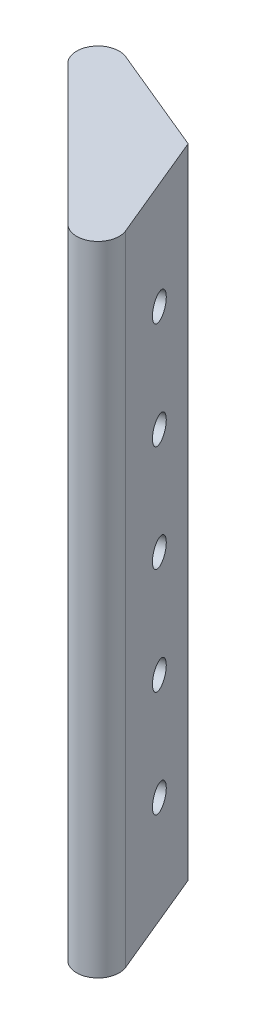
ISO-10303-21;
HEADER;
FILE_DESCRIPTION(('STEP AP214'),'2;1');
FILE_NAME('part.step','',(''),(''),'','','');
FILE_SCHEMA(('AUTOMOTIVE_DESIGN { 1 0 10303 214 1 1 1 1 }'));
ENDSEC;
DATA;
#1=APPLICATION_CONTEXT('core data for automotive mechanical design processes');
#2=APPLICATION_PROTOCOL_DEFINITION('international standard','automotive_design',2000,#1);
#3=PRODUCT_CONTEXT('',#1,'mechanical');
#4=PRODUCT('Part','Part','',(#3));
#5=PRODUCT_RELATED_PRODUCT_CATEGORY('part','',(#4));
#6=PRODUCT_DEFINITION_FORMATION('','',#4);
#7=PRODUCT_DEFINITION_CONTEXT('part definition',#1,'design');
#8=PRODUCT_DEFINITION('design','',#6,#7);
#9=PRODUCT_DEFINITION_SHAPE('','',#8);
#10=(LENGTH_UNIT() NAMED_UNIT(*) SI_UNIT(.MILLI.,.METRE.));
#11=(NAMED_UNIT(*) PLANE_ANGLE_UNIT() SI_UNIT($,.RADIAN.));
#12=(NAMED_UNIT(*) SI_UNIT($,.STERADIAN.) SOLID_ANGLE_UNIT());
#13=UNCERTAINTY_MEASURE_WITH_UNIT(LENGTH_MEASURE(1.E-05),#10,'distance_accuracy_value','');
#14=(GEOMETRIC_REPRESENTATION_CONTEXT(3) GLOBAL_UNCERTAINTY_ASSIGNED_CONTEXT((#13)) GLOBAL_UNIT_ASSIGNED_CONTEXT((#10,
#11,#12)) REPRESENTATION_CONTEXT('',''));
#15=CARTESIAN_POINT('',(0.,0.,0.));
#16=DIRECTION('',(0.,0.,1.));
#17=DIRECTION('',(1.,0.,0.));
#18=AXIS2_PLACEMENT_3D('',#15,#16,#17);
#19=CARTESIAN_POINT('',(252.896471972286,90.,-238.719834657845));
#20=DIRECTION('',(-0.923879532511289,0.,0.382683432365085));
#21=DIRECTION('',(0.382683432365085,0.,0.923879532511289));
#22=AXIS2_PLACEMENT_3D('',#19,#20,#21);
#23=PLANE('',#22);
#24=CARTESIAN_POINT('',(250.657648199135,80.,-244.124833374748));
#25=DIRECTION('',(0.923879532511287,0.,-0.38268343236509));
#26=DIRECTION('',(-0.38268343236509,0.,-0.923879532511287));
#27=AXIS2_PLACEMENT_3D('',#24,#25,#26);
#28=CIRCLE('',#27,1.20000000000003);
#29=CARTESIAN_POINT('',(250.198428080297,80.,-245.233488813762));
#30=VERTEX_POINT('',#29);
#31=EDGE_CURVE('E148',#30,#30,#28,.T.);
#32=ORIENTED_EDGE('',*,*,#31,.F.);
#33=EDGE_LOOP('',(#32));
#34=FACE_BOUND('',#33,.T.);
#35=CARTESIAN_POINT('',(250.657648199134,70.,-244.12483337475));
#36=DIRECTION('',(0.923879532511287,0.,-0.38268343236509));
#37=DIRECTION('',(-0.38268343236509,0.,-0.923879532511287));
#38=AXIS2_PLACEMENT_3D('',#35,#36,#37);
#39=CIRCLE('',#38,1.20000000000001);
#40=CARTESIAN_POINT('',(250.198428080296,70.,-245.233488813764));
#41=VERTEX_POINT('',#40);
#42=EDGE_CURVE('E152',#41,#41,#39,.T.);
#43=ORIENTED_EDGE('',*,*,#42,.F.);
#44=EDGE_LOOP('',(#43));
#45=FACE_BOUND('',#44,.T.);
#46=CARTESIAN_POINT('',(250.657648199135,60.,-244.124833374748));
#47=DIRECTION('',(0.923879532511287,0.,-0.38268343236509));
#48=DIRECTION('',(-0.38268343236509,0.,-0.923879532511287));
#49=AXIS2_PLACEMENT_3D('',#46,#47,#48);
#50=CIRCLE('',#49,1.20000000000003);
#51=CARTESIAN_POINT('',(250.198428080297,60.,-245.233488813762));
#52=VERTEX_POINT('',#51);
#53=EDGE_CURVE('E156',#52,#52,#50,.T.);
#54=ORIENTED_EDGE('',*,*,#53,.F.);
#55=EDGE_LOOP('',(#54));
#56=FACE_BOUND('',#55,.T.);
#57=CARTESIAN_POINT('',(250.657648199134,50.,-244.12483337475));
#58=DIRECTION('',(0.923879532511287,0.,-0.38268343236509));
#59=DIRECTION('',(-0.38268343236509,0.,-0.923879532511287));
#60=AXIS2_PLACEMENT_3D('',#57,#58,#59);
#61=CIRCLE('',#60,1.20000000000001);
#62=CARTESIAN_POINT('',(250.198428080296,50.,-245.233488813764));
#63=VERTEX_POINT('',#62);
#64=EDGE_CURVE('E160',#63,#63,#61,.T.);
#65=ORIENTED_EDGE('',*,*,#64,.F.);
#66=EDGE_LOOP('',(#65));
#67=FACE_BOUND('',#66,.T.);
#68=CARTESIAN_POINT('',(250.657648199135,40.,-244.124833374748));
#69=DIRECTION('',(0.923879532511287,0.,-0.38268343236509));
#70=DIRECTION('',(-0.38268343236509,0.,-0.923879532511287));
#71=AXIS2_PLACEMENT_3D('',#68,#69,#70);
#72=CIRCLE('',#71,1.20000000000003);
#73=CARTESIAN_POINT('',(250.198428080297,40.,-245.233488813762));
#74=VERTEX_POINT('',#73);
#75=EDGE_CURVE('E163',#74,#74,#72,.T.);
#76=ORIENTED_EDGE('',*,*,#75,.F.);
#77=EDGE_LOOP('',(#76));
#78=FACE_BOUND('',#77,.T.);
#79=DIRECTION('',(-0.382683432365085,0.,-0.923879532511289));
#80=VECTOR('',#79,1.);
#81=CARTESIAN_POINT('',(252.896471972286,30.,-238.719834657845));
#82=LINE('',#81,#80);
#83=CARTESIAN_POINT('',(252.896471972286,30.,-238.719834657845));
#84=VERTEX_POINT('',#83);
#85=CARTESIAN_POINT('',(248.744231037308,30.,-248.744231037309));
#86=VERTEX_POINT('',#85);
#87=EDGE_CURVE('E110',#84,#86,#82,.T.);
#88=ORIENTED_EDGE('',*,*,#87,.T.);
#89=DIRECTION('',(0.,-1.,0.));
#90=VECTOR('',#89,1.);
#91=CARTESIAN_POINT('',(248.744231037308,90.,-248.744231037309));
#92=LINE('',#91,#90);
#93=CARTESIAN_POINT('',(248.744231037308,90.,-248.744231037309));
#94=VERTEX_POINT('',#93);
#95=EDGE_CURVE('E11',#94,#86,#92,.T.);
#96=ORIENTED_EDGE('',*,*,#95,.F.);
#97=DIRECTION('',(-0.382683432365085,0.,-0.923879532511289));
#98=VECTOR('',#97,1.);
#99=CARTESIAN_POINT('',(252.896471972286,90.,-238.719834657845));
#100=LINE('',#99,#98);
#101=CARTESIAN_POINT('',(252.896471972286,90.,-238.719834657845));
#102=VERTEX_POINT('',#101);
#103=EDGE_CURVE('E119',#102,#94,#100,.T.);
#104=ORIENTED_EDGE('',*,*,#103,.F.);
#105=DIRECTION('',(0.,-1.,0.));
#106=VECTOR('',#105,1.);
#107=CARTESIAN_POINT('',(252.896471972286,90.,-238.719834657845));
#108=LINE('',#107,#106);
#109=EDGE_CURVE('E106',#102,#84,#108,.T.);
#110=ORIENTED_EDGE('',*,*,#109,.T.);
#111=EDGE_LOOP('',(#88,#96,#104,#110));
#112=FACE_BOUND('',#111,.T.);
#113=ADVANCED_FACE('F36',(#34,#45,#56,#67,#78,#112),#23,.F.);
#114=CARTESIAN_POINT('',(248.744231037308,90.,-248.744231037309));
#115=DIRECTION('',(-0.382683432365088,0.,0.923879532511288));
#116=DIRECTION('',(0.923879532511288,0.,0.382683432365088));
#117=AXIS2_PLACEMENT_3D('',#114,#115,#116);
#118=PLANE('',#117);
#119=CARTESIAN_POINT('',(244.124833374753,80.,-250.657648199133));
#120=DIRECTION('',(0.38268343236509,0.,-0.923879532511287));
#121=DIRECTION('',(-0.923879532511287,0.,-0.38268343236509));
#122=AXIS2_PLACEMENT_3D('',#119,#120,#121);
#123=CIRCLE('',#122,1.20000000000003);
#124=CARTESIAN_POINT('',(243.016177935739,80.,-251.116868317972));
#125=VERTEX_POINT('',#124);
#126=EDGE_CURVE('E173',#125,#125,#123,.T.);
#127=ORIENTED_EDGE('',*,*,#126,.F.);
#128=EDGE_LOOP('',(#127));
#129=FACE_BOUND('',#128,.T.);
#130=CARTESIAN_POINT('',(244.124833374755,70.,-250.657648199133));
#131=DIRECTION('',(0.38268343236509,0.,-0.923879532511287));
#132=DIRECTION('',(-0.923879532511287,0.,-0.38268343236509));
#133=AXIS2_PLACEMENT_3D('',#130,#131,#132);
#134=CIRCLE('',#133,1.20000000000003);
#135=CARTESIAN_POINT('',(243.016177935742,70.,-251.116868317971));
#136=VERTEX_POINT('',#135);
#137=EDGE_CURVE('E179',#136,#136,#134,.T.);
#138=ORIENTED_EDGE('',*,*,#137,.F.);
#139=EDGE_LOOP('',(#138));
#140=FACE_BOUND('',#139,.T.);
#141=CARTESIAN_POINT('',(244.124833374753,60.,-250.657648199133));
#142=DIRECTION('',(0.38268343236509,0.,-0.923879532511287));
#143=DIRECTION('',(-0.923879532511287,0.,-0.38268343236509));
#144=AXIS2_PLACEMENT_3D('',#141,#142,#143);
#145=CIRCLE('',#144,1.20000000000003);
#146=CARTESIAN_POINT('',(243.016177935739,60.,-251.116868317972));
#147=VERTEX_POINT('',#146);
#148=EDGE_CURVE('E185',#147,#147,#145,.T.);
#149=ORIENTED_EDGE('',*,*,#148,.F.);
#150=EDGE_LOOP('',(#149));
#151=FACE_BOUND('',#150,.T.);
#152=CARTESIAN_POINT('',(244.124833374755,50.,-250.657648199133));
#153=DIRECTION('',(0.38268343236509,0.,-0.923879532511287));
#154=DIRECTION('',(-0.923879532511287,0.,-0.38268343236509));
#155=AXIS2_PLACEMENT_3D('',#152,#153,#154);
#156=CIRCLE('',#155,1.20000000000003);
#157=CARTESIAN_POINT('',(243.016177935742,50.,-251.116868317971));
#158=VERTEX_POINT('',#157);
#159=EDGE_CURVE('E191',#158,#158,#156,.T.);
#160=ORIENTED_EDGE('',*,*,#159,.F.);
#161=EDGE_LOOP('',(#160));
#162=FACE_BOUND('',#161,.T.);
#163=CARTESIAN_POINT('',(244.124833374753,40.,-250.657648199133));
#164=DIRECTION('',(0.38268343236509,0.,-0.923879532511287));
#165=DIRECTION('',(-0.923879532511287,0.,-0.38268343236509));
#166=AXIS2_PLACEMENT_3D('',#163,#164,#165);
#167=CIRCLE('',#166,1.20000000000003);
#168=CARTESIAN_POINT('',(243.016177935739,40.,-251.116868317972));
#169=VERTEX_POINT('',#168);
#170=EDGE_CURVE('E197',#169,#169,#167,.T.);
#171=ORIENTED_EDGE('',*,*,#170,.F.);
#172=EDGE_LOOP('',(#171));
#173=FACE_BOUND('',#172,.T.);
#174=DIRECTION('',(-0.923879532511288,0.,-0.382683432365087));
#175=VECTOR('',#174,1.);
#176=CARTESIAN_POINT('',(248.744231037308,30.,-248.744231037309));
#177=LINE('',#176,#175);
#178=CARTESIAN_POINT('',(238.719834657845,30.,-252.896471972286));
#179=VERTEX_POINT('',#178);
#180=EDGE_CURVE('E113',#86,#179,#177,.T.);
#181=ORIENTED_EDGE('',*,*,#180,.T.);
#182=DIRECTION('',(0.,-1.,0.));
#183=VECTOR('',#182,1.);
#184=CARTESIAN_POINT('',(238.719834657845,90.,-252.896471972286));
#185=LINE('',#184,#183);
#186=CARTESIAN_POINT('',(238.719834657845,90.,-252.896471972286));
#187=VERTEX_POINT('',#186);
#188=EDGE_CURVE('E44',#187,#179,#185,.T.);
#189=ORIENTED_EDGE('',*,*,#188,.F.);
#190=DIRECTION('',(-0.923879532511288,0.,-0.382683432365087));
#191=VECTOR('',#190,1.);
#192=CARTESIAN_POINT('',(248.744231037308,90.,-248.744231037309));
#193=LINE('',#192,#191);
#194=EDGE_CURVE('E86',#94,#187,#193,.T.);
#195=ORIENTED_EDGE('',*,*,#194,.F.);
#196=ORIENTED_EDGE('',*,*,#95,.T.);
#197=EDGE_LOOP('',(#181,#189,#195,#196));
#198=FACE_BOUND('',#197,.T.);
#199=ADVANCED_FACE('F139',(#129,#140,#151,#162,#173,#198),#118,.F.);
#200=CARTESIAN_POINT('',(237.954467793115,90.,-251.048712907264));
#201=DIRECTION('',(0.,-1.,0.));
#202=DIRECTION('',(0.,0.,-1.));
#203=AXIS2_PLACEMENT_3D('',#200,#201,#202);
#204=CYLINDRICAL_SURFACE('',#203,1.99999999999994);
#205=CARTESIAN_POINT('',(237.954467793115,30.,-251.048712907264));
#206=DIRECTION('',(0.,1.,0.));
#207=DIRECTION('',(0.,0.,1.));
#208=AXIS2_PLACEMENT_3D('',#205,#206,#207);
#209=CIRCLE('',#208,1.99999999999994);
#210=CARTESIAN_POINT('',(236.540254230742,30.,-249.634499344891));
#211=VERTEX_POINT('',#210);
#212=EDGE_CURVE('E101',#179,#211,#209,.T.);
#213=ORIENTED_EDGE('',*,*,#212,.T.);
#214=DIRECTION('',(0.,-1.,0.));
#215=VECTOR('',#214,1.);
#216=CARTESIAN_POINT('',(236.540254230742,90.,-249.634499344891));
#217=LINE('',#216,#215);
#218=CARTESIAN_POINT('',(236.540254230742,90.,-249.634499344891));
#219=VERTEX_POINT('',#218);
#220=EDGE_CURVE('E98',#219,#211,#217,.T.);
#221=ORIENTED_EDGE('',*,*,#220,.F.);
#222=CARTESIAN_POINT('',(237.954467793115,90.,-251.048712907264));
#223=DIRECTION('',(0.,1.,0.));
#224=DIRECTION('',(0.,0.,1.));
#225=AXIS2_PLACEMENT_3D('',#222,#223,#224);
#226=CIRCLE('',#225,1.99999999999994);
#227=EDGE_CURVE('E90',#187,#219,#226,.T.);
#228=ORIENTED_EDGE('',*,*,#227,.F.);
#229=ORIENTED_EDGE('',*,*,#188,.T.);
#230=EDGE_LOOP('',(#213,#221,#228,#229));
#231=FACE_BOUND('',#230,.T.);
#232=ADVANCED_FACE('F99',(#231),#204,.T.);
#233=CARTESIAN_POINT('',(236.540254230742,90.,-249.634499344891));
#234=DIRECTION('',(0.707106781186548,0.,-0.707106781186547));
#235=DIRECTION('',(-0.707106781186547,0.,-0.707106781186548));
#236=AXIS2_PLACEMENT_3D('',#233,#234,#235);
#237=PLANE('',#236);
#238=CARTESIAN_POINT('',(244.571065360963,80.,-241.60368821467));
#239=DIRECTION('',(0.707106781186548,0.,-0.707106781186547));
#240=DIRECTION('',(0.707106781186547,0.,0.707106781186548));
#241=AXIS2_PLACEMENT_3D('',#238,#239,#240);
#242=ELLIPSE('',#241,1.29887064035091,1.20000000000003);
#243=CARTESIAN_POINT('',(245.489505598639,80.,-240.685247976993));
#244=VERTEX_POINT('',#243);
#245=EDGE_CURVE('E200',#244,#244,#242,.F.);
#246=ORIENTED_EDGE('',*,*,#245,.F.);
#247=EDGE_LOOP('',(#246));
#248=FACE_BOUND('',#247,.T.);
#249=CARTESIAN_POINT('',(244.571065360961,70.,-241.603688214672));
#250=DIRECTION('',(0.707106781186548,0.,-0.707106781186547));
#251=DIRECTION('',(0.707106781186547,0.,0.707106781186548));
#252=AXIS2_PLACEMENT_3D('',#249,#250,#251);
#253=ELLIPSE('',#252,1.29887064035088,1.20000000000001);
#254=CARTESIAN_POINT('',(245.489505598637,70.,-240.685247976995));
#255=VERTEX_POINT('',#254);
#256=EDGE_CURVE('E256',#255,#255,#253,.F.);
#257=ORIENTED_EDGE('',*,*,#256,.F.);
#258=EDGE_LOOP('',(#257));
#259=FACE_BOUND('',#258,.T.);
#260=CARTESIAN_POINT('',(244.571065360963,60.,-241.60368821467));
#261=DIRECTION('',(0.707106781186548,0.,-0.707106781186547));
#262=DIRECTION('',(0.707106781186547,0.,0.707106781186548));
#263=AXIS2_PLACEMENT_3D('',#260,#261,#262);
#264=ELLIPSE('',#263,1.29887064035091,1.20000000000003);
#265=CARTESIAN_POINT('',(245.489505598639,60.,-240.685247976993));
#266=VERTEX_POINT('',#265);
#267=EDGE_CURVE('E262',#266,#266,#264,.F.);
#268=ORIENTED_EDGE('',*,*,#267,.F.);
#269=EDGE_LOOP('',(#268));
#270=FACE_BOUND('',#269,.T.);
#271=CARTESIAN_POINT('',(244.571065360961,50.,-241.603688214672));
#272=DIRECTION('',(0.707106781186548,0.,-0.707106781186547));
#273=DIRECTION('',(0.707106781186547,0.,0.707106781186548));
#274=AXIS2_PLACEMENT_3D('',#271,#272,#273);
#275=ELLIPSE('',#274,1.29887064035088,1.20000000000001);
#276=CARTESIAN_POINT('',(245.489505598637,50.,-240.685247976995));
#277=VERTEX_POINT('',#276);
#278=EDGE_CURVE('E170',#277,#277,#275,.F.);
#279=ORIENTED_EDGE('',*,*,#278,.F.);
#280=EDGE_LOOP('',(#279));
#281=FACE_BOUND('',#280,.T.);
#282=CARTESIAN_POINT('',(244.571065360963,40.,-241.60368821467));
#283=DIRECTION('',(0.707106781186548,0.,-0.707106781186547));
#284=DIRECTION('',(0.707106781186547,0.,0.707106781186548));
#285=AXIS2_PLACEMENT_3D('',#282,#283,#284);
#286=ELLIPSE('',#285,1.29887064035091,1.20000000000003);
#287=CARTESIAN_POINT('',(245.489505598639,40.,-240.685247976993));
#288=VERTEX_POINT('',#287);
#289=EDGE_CURVE('E165',#288,#288,#286,.F.);
#290=ORIENTED_EDGE('',*,*,#289,.F.);
#291=EDGE_LOOP('',(#290));
#292=FACE_BOUND('',#291,.T.);
#293=CARTESIAN_POINT('',(241.603688214674,80.,-244.571065360959));
#294=DIRECTION('',(0.707106781186548,0.,-0.707106781186547));
#295=DIRECTION('',(-0.707106781186547,0.,-0.707106781186548));
#296=AXIS2_PLACEMENT_3D('',#293,#294,#295);
#297=ELLIPSE('',#296,1.29887064035091,1.20000000000003);
#298=CARTESIAN_POINT('',(240.685247976997,80.,-245.489505598635));
#299=VERTEX_POINT('',#298);
#300=EDGE_CURVE('E114',#299,#299,#297,.F.);
#301=ORIENTED_EDGE('',*,*,#300,.F.);
#302=EDGE_LOOP('',(#301));
#303=FACE_BOUND('',#302,.T.);
#304=CARTESIAN_POINT('',(241.603688214675,70.,-244.571065360957));
#305=DIRECTION('',(0.707106781186548,0.,-0.707106781186547));
#306=DIRECTION('',(-0.707106781186547,0.,-0.707106781186548));
#307=AXIS2_PLACEMENT_3D('',#304,#305,#306);
#308=ELLIPSE('',#307,1.29887064035091,1.20000000000003);
#309=CARTESIAN_POINT('',(240.685247976999,70.,-245.489505598633));
#310=VERTEX_POINT('',#309);
#311=EDGE_CURVE('E176',#310,#310,#308,.F.);
#312=ORIENTED_EDGE('',*,*,#311,.F.);
#313=EDGE_LOOP('',(#312));
#314=FACE_BOUND('',#313,.T.);
#315=CARTESIAN_POINT('',(241.603688214674,60.,-244.571065360959));
#316=DIRECTION('',(0.707106781186548,0.,-0.707106781186547));
#317=DIRECTION('',(-0.707106781186547,0.,-0.707106781186548));
#318=AXIS2_PLACEMENT_3D('',#315,#316,#317);
#319=ELLIPSE('',#318,1.29887064035091,1.20000000000003);
#320=CARTESIAN_POINT('',(240.685247976997,60.,-245.489505598635));
#321=VERTEX_POINT('',#320);
#322=EDGE_CURVE('E182',#321,#321,#319,.F.);
#323=ORIENTED_EDGE('',*,*,#322,.F.);
#324=EDGE_LOOP('',(#323));
#325=FACE_BOUND('',#324,.T.);
#326=CARTESIAN_POINT('',(241.603688214675,50.,-244.571065360957));
#327=DIRECTION('',(0.707106781186548,0.,-0.707106781186547));
#328=DIRECTION('',(-0.707106781186547,0.,-0.707106781186548));
#329=AXIS2_PLACEMENT_3D('',#326,#327,#328);
#330=ELLIPSE('',#329,1.29887064035091,1.20000000000003);
#331=CARTESIAN_POINT('',(240.685247976999,50.,-245.489505598633));
#332=VERTEX_POINT('',#331);
#333=EDGE_CURVE('E188',#332,#332,#330,.F.);
#334=ORIENTED_EDGE('',*,*,#333,.F.);
#335=EDGE_LOOP('',(#334));
#336=FACE_BOUND('',#335,.T.);
#337=CARTESIAN_POINT('',(241.603688214674,40.,-244.571065360959));
#338=DIRECTION('',(0.707106781186548,0.,-0.707106781186547));
#339=DIRECTION('',(-0.707106781186547,0.,-0.707106781186548));
#340=AXIS2_PLACEMENT_3D('',#337,#338,#339);
#341=ELLIPSE('',#340,1.29887064035091,1.20000000000003);
#342=CARTESIAN_POINT('',(240.685247976997,40.,-245.489505598635));
#343=VERTEX_POINT('',#342);
#344=EDGE_CURVE('E194',#343,#343,#341,.F.);
#345=ORIENTED_EDGE('',*,*,#344,.F.);
#346=EDGE_LOOP('',(#345));
#347=FACE_BOUND('',#346,.T.);
#348=DIRECTION('',(0.707106781186547,0.,0.707106781186548));
#349=VECTOR('',#348,1.);
#350=CARTESIAN_POINT('',(236.540254230742,30.,-249.634499344891));
#351=LINE('',#350,#349);
#352=CARTESIAN_POINT('',(249.63449934489,30.,-236.540254230742));
#353=VERTEX_POINT('',#352);
#354=EDGE_CURVE('E72',#211,#353,#351,.T.);
#355=ORIENTED_EDGE('',*,*,#354,.T.);
#356=DIRECTION('',(0.,-1.,0.));
#357=VECTOR('',#356,1.);
#358=CARTESIAN_POINT('',(249.63449934489,90.,-236.540254230742));
#359=LINE('',#358,#357);
#360=CARTESIAN_POINT('',(249.63449934489,90.,-236.540254230742));
#361=VERTEX_POINT('',#360);
#362=EDGE_CURVE('E102',#361,#353,#359,.T.);
#363=ORIENTED_EDGE('',*,*,#362,.F.);
#364=DIRECTION('',(0.707106781186547,0.,0.707106781186548));
#365=VECTOR('',#364,1.);
#366=CARTESIAN_POINT('',(236.540254230742,90.,-249.634499344891));
#367=LINE('',#366,#365);
#368=EDGE_CURVE('E94',#219,#361,#367,.T.);
#369=ORIENTED_EDGE('',*,*,#368,.F.);
#370=ORIENTED_EDGE('',*,*,#220,.T.);
#371=EDGE_LOOP('',(#355,#363,#369,#370));
#372=FACE_BOUND('',#371,.T.);
#373=ADVANCED_FACE('F104',(#248,#259,#270,#281,#292,#303,#314,#325,#336,#347,#372),#237,.F.);
#374=CARTESIAN_POINT('',(251.048712907263,90.,-237.954467793115));
#375=DIRECTION('',(0.,-1.,0.));
#376=DIRECTION('',(0.,0.,-1.));
#377=AXIS2_PLACEMENT_3D('',#374,#375,#376);
#378=CYLINDRICAL_SURFACE('',#377,1.99999999999994);
#379=CARTESIAN_POINT('',(251.048712907263,30.,-237.954467793115));
#380=DIRECTION('',(0.,1.,0.));
#381=DIRECTION('',(0.,0.,1.));
#382=AXIS2_PLACEMENT_3D('',#379,#380,#381);
#383=CIRCLE('',#382,1.99999999999994);
#384=EDGE_CURVE('E78',#353,#84,#383,.T.);
#385=ORIENTED_EDGE('',*,*,#384,.T.);
#386=ORIENTED_EDGE('',*,*,#109,.F.);
#387=CARTESIAN_POINT('',(251.048712907263,90.,-237.954467793115));
#388=DIRECTION('',(0.,1.,0.));
#389=DIRECTION('',(0.,0.,1.));
#390=AXIS2_PLACEMENT_3D('',#387,#388,#389);
#391=CIRCLE('',#390,1.99999999999994);
#392=EDGE_CURVE('E52',#361,#102,#391,.T.);
#393=ORIENTED_EDGE('',*,*,#392,.F.);
#394=ORIENTED_EDGE('',*,*,#362,.T.);
#395=EDGE_LOOP('',(#385,#386,#393,#394));
#396=FACE_BOUND('',#395,.T.);
#397=ADVANCED_FACE('F127',(#396),#378,.T.);
#398=CARTESIAN_POINT('',(237.954467793115,90.,-251.048712907264));
#399=DIRECTION('',(0.,1.,0.));
#400=DIRECTION('',(0.,0.,1.));
#401=AXIS2_PLACEMENT_3D('',#398,#399,#400);
#402=PLANE('',#401);
#403=ORIENTED_EDGE('',*,*,#103,.T.);
#404=ORIENTED_EDGE('',*,*,#194,.T.);
#405=ORIENTED_EDGE('',*,*,#227,.T.);
#406=ORIENTED_EDGE('',*,*,#368,.T.);
#407=ORIENTED_EDGE('',*,*,#392,.T.);
#408=EDGE_LOOP('',(#403,#404,#405,#406,#407));
#409=FACE_BOUND('',#408,.T.);
#410=ADVANCED_FACE('F92',(#409),#402,.T.);
#411=CARTESIAN_POINT('',(237.954467793115,30.,-251.048712907264));
#412=DIRECTION('',(0.,1.,0.));
#413=DIRECTION('',(0.,0.,1.));
#414=AXIS2_PLACEMENT_3D('',#411,#412,#413);
#415=PLANE('',#414);
#416=ORIENTED_EDGE('',*,*,#87,.F.);
#417=ORIENTED_EDGE('',*,*,#384,.F.);
#418=ORIENTED_EDGE('',*,*,#354,.F.);
#419=ORIENTED_EDGE('',*,*,#212,.F.);
#420=ORIENTED_EDGE('',*,*,#180,.F.);
#421=EDGE_LOOP('',(#416,#417,#418,#419,#420));
#422=FACE_BOUND('',#421,.T.);
#423=ADVANCED_FACE('F123',(#422),#415,.F.);
#424=CARTESIAN_POINT('',(240.251309169346,40.,-241.306133528258));
#425=DIRECTION('',(0.38268343236509,0.,-0.923879532511287));
#426=DIRECTION('',(-0.923879532511287,0.,-0.38268343236509));
#427=AXIS2_PLACEMENT_3D('',#424,#425,#426);
#428=CYLINDRICAL_SURFACE('',#427,1.20000000000003);
#429=ORIENTED_EDGE('',*,*,#344,.T.);
#430=EDGE_LOOP('',(#429));
#431=FACE_BOUND('',#430,.T.);
#432=ORIENTED_EDGE('',*,*,#170,.T.);
#433=EDGE_LOOP('',(#432));
#434=FACE_BOUND('',#433,.T.);
#435=ADVANCED_FACE('F205',(#431,#434),#428,.F.);
#436=CARTESIAN_POINT('',(240.251309169348,50.,-241.306133528257));
#437=DIRECTION('',(0.38268343236509,0.,-0.923879532511287));
#438=DIRECTION('',(-0.923879532511287,0.,-0.38268343236509));
#439=AXIS2_PLACEMENT_3D('',#436,#437,#438);
#440=CYLINDRICAL_SURFACE('',#439,1.20000000000003);
#441=ORIENTED_EDGE('',*,*,#333,.T.);
#442=EDGE_LOOP('',(#441));
#443=FACE_BOUND('',#442,.T.);
#444=ORIENTED_EDGE('',*,*,#159,.T.);
#445=EDGE_LOOP('',(#444));
#446=FACE_BOUND('',#445,.T.);
#447=ADVANCED_FACE('F209',(#443,#446),#440,.F.);
#448=CARTESIAN_POINT('',(240.251309169346,60.,-241.306133528258));
#449=DIRECTION('',(0.38268343236509,0.,-0.923879532511287));
#450=DIRECTION('',(-0.923879532511287,0.,-0.38268343236509));
#451=AXIS2_PLACEMENT_3D('',#448,#449,#450);
#452=CYLINDRICAL_SURFACE('',#451,1.20000000000003);
#453=ORIENTED_EDGE('',*,*,#322,.T.);
#454=EDGE_LOOP('',(#453));
#455=FACE_BOUND('',#454,.T.);
#456=ORIENTED_EDGE('',*,*,#148,.T.);
#457=EDGE_LOOP('',(#456));
#458=FACE_BOUND('',#457,.T.);
#459=ADVANCED_FACE('F217',(#455,#458),#452,.F.);
#460=CARTESIAN_POINT('',(240.251309169348,70.,-241.306133528257));
#461=DIRECTION('',(0.38268343236509,0.,-0.923879532511287));
#462=DIRECTION('',(-0.923879532511287,0.,-0.38268343236509));
#463=AXIS2_PLACEMENT_3D('',#460,#461,#462);
#464=CYLINDRICAL_SURFACE('',#463,1.20000000000003);
#465=ORIENTED_EDGE('',*,*,#311,.T.);
#466=EDGE_LOOP('',(#465));
#467=FACE_BOUND('',#466,.T.);
#468=ORIENTED_EDGE('',*,*,#137,.T.);
#469=EDGE_LOOP('',(#468));
#470=FACE_BOUND('',#469,.T.);
#471=ADVANCED_FACE('F223',(#467,#470),#464,.F.);
#472=CARTESIAN_POINT('',(240.251309169346,80.,-241.306133528258));
#473=DIRECTION('',(0.38268343236509,0.,-0.923879532511287));
#474=DIRECTION('',(-0.923879532511287,0.,-0.38268343236509));
#475=AXIS2_PLACEMENT_3D('',#472,#473,#474);
#476=CYLINDRICAL_SURFACE('',#475,1.20000000000003);
#477=ORIENTED_EDGE('',*,*,#300,.T.);
#478=EDGE_LOOP('',(#477));
#479=FACE_BOUND('',#478,.T.);
#480=ORIENTED_EDGE('',*,*,#126,.T.);
#481=EDGE_LOOP('',(#480));
#482=FACE_BOUND('',#481,.T.);
#483=ADVANCED_FACE('F227',(#479,#482),#476,.F.);
#484=CARTESIAN_POINT('',(241.306133528262,40.,-240.251309169342));
#485=DIRECTION('',(0.923879532511287,0.,-0.38268343236509));
#486=DIRECTION('',(-0.38268343236509,0.,-0.923879532511287));
#487=AXIS2_PLACEMENT_3D('',#484,#485,#486);
#488=CYLINDRICAL_SURFACE('',#487,1.20000000000003);
#489=ORIENTED_EDGE('',*,*,#289,.T.);
#490=EDGE_LOOP('',(#489));
#491=FACE_BOUND('',#490,.T.);
#492=ORIENTED_EDGE('',*,*,#75,.T.);
#493=EDGE_LOOP('',(#492));
#494=FACE_BOUND('',#493,.T.);
#495=ADVANCED_FACE('F231',(#491,#494),#488,.F.);
#496=CARTESIAN_POINT('',(241.306133528261,50.,-240.251309169344));
#497=DIRECTION('',(0.923879532511287,0.,-0.38268343236509));
#498=DIRECTION('',(-0.38268343236509,0.,-0.923879532511287));
#499=AXIS2_PLACEMENT_3D('',#496,#497,#498);
#500=CYLINDRICAL_SURFACE('',#499,1.20000000000001);
#501=ORIENTED_EDGE('',*,*,#278,.T.);
#502=EDGE_LOOP('',(#501));
#503=FACE_BOUND('',#502,.T.);
#504=ORIENTED_EDGE('',*,*,#64,.T.);
#505=EDGE_LOOP('',(#504));
#506=FACE_BOUND('',#505,.T.);
#507=ADVANCED_FACE('F235',(#503,#506),#500,.F.);
#508=CARTESIAN_POINT('',(241.306133528262,60.,-240.251309169342));
#509=DIRECTION('',(0.923879532511287,0.,-0.38268343236509));
#510=DIRECTION('',(-0.38268343236509,0.,-0.923879532511287));
#511=AXIS2_PLACEMENT_3D('',#508,#509,#510);
#512=CYLINDRICAL_SURFACE('',#511,1.20000000000003);
#513=ORIENTED_EDGE('',*,*,#267,.T.);
#514=EDGE_LOOP('',(#513));
#515=FACE_BOUND('',#514,.T.);
#516=ORIENTED_EDGE('',*,*,#53,.T.);
#517=EDGE_LOOP('',(#516));
#518=FACE_BOUND('',#517,.T.);
#519=ADVANCED_FACE('F239',(#515,#518),#512,.F.);
#520=CARTESIAN_POINT('',(241.306133528261,70.,-240.251309169344));
#521=DIRECTION('',(0.923879532511287,0.,-0.38268343236509));
#522=DIRECTION('',(-0.38268343236509,0.,-0.923879532511287));
#523=AXIS2_PLACEMENT_3D('',#520,#521,#522);
#524=CYLINDRICAL_SURFACE('',#523,1.20000000000001);
#525=ORIENTED_EDGE('',*,*,#256,.T.);
#526=EDGE_LOOP('',(#525));
#527=FACE_BOUND('',#526,.T.);
#528=ORIENTED_EDGE('',*,*,#42,.T.);
#529=EDGE_LOOP('',(#528));
#530=FACE_BOUND('',#529,.T.);
#531=ADVANCED_FACE('F243',(#527,#530),#524,.F.);
#532=CARTESIAN_POINT('',(241.306133528262,80.,-240.251309169342));
#533=DIRECTION('',(0.923879532511287,0.,-0.38268343236509));
#534=DIRECTION('',(-0.38268343236509,0.,-0.923879532511287));
#535=AXIS2_PLACEMENT_3D('',#532,#533,#534);
#536=CYLINDRICAL_SURFACE('',#535,1.20000000000003);
#537=ORIENTED_EDGE('',*,*,#245,.T.);
#538=EDGE_LOOP('',(#537));
#539=FACE_BOUND('',#538,.T.);
#540=ORIENTED_EDGE('',*,*,#31,.T.);
#541=EDGE_LOOP('',(#540));
#542=FACE_BOUND('',#541,.T.);
#543=ADVANCED_FACE('F247',(#539,#542),#536,.F.);
#544=CLOSED_SHELL('',(#113,#199,#232,#373,#397,#410,#423,#435,#447,#459,#471,#483,#495,#507,
#519,#531,#543));
#545=MANIFOLD_SOLID_BREP('B2',#544);
#546=ADVANCED_BREP_SHAPE_REPRESENTATION('',(#18,#545),#14);
#547=SHAPE_DEFINITION_REPRESENTATION(#9,#546);
ENDSEC;
END-ISO-10303-21;
